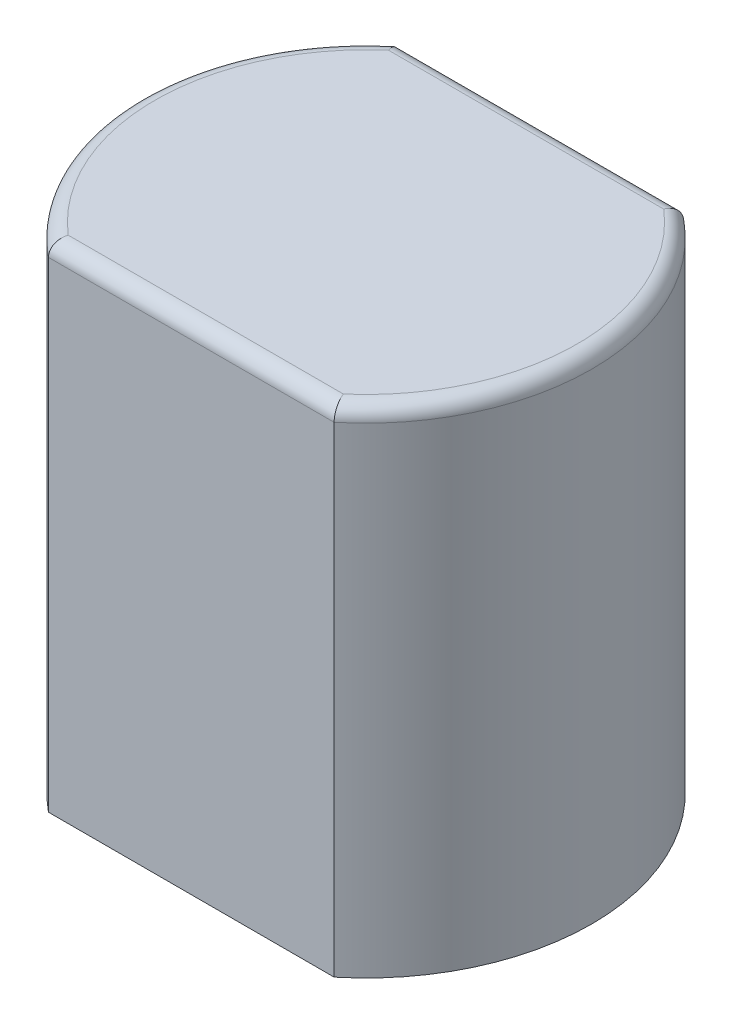
ISO-10303-21;
HEADER;
FILE_DESCRIPTION(('STEP AP214'),'2;1');
FILE_NAME('part.step','',(''),(''),'','','');
FILE_SCHEMA(('AUTOMOTIVE_DESIGN { 1 0 10303 214 1 1 1 1 }'));
ENDSEC;
DATA;
#1=APPLICATION_CONTEXT('core data for automotive mechanical design processes');
#2=APPLICATION_PROTOCOL_DEFINITION('international standard','automotive_design',2000,#1);
#3=PRODUCT_CONTEXT('',#1,'mechanical');
#4=PRODUCT('Part','Part','',(#3));
#5=PRODUCT_RELATED_PRODUCT_CATEGORY('part','',(#4));
#6=PRODUCT_DEFINITION_FORMATION('','',#4);
#7=PRODUCT_DEFINITION_CONTEXT('part definition',#1,'design');
#8=PRODUCT_DEFINITION('design','',#6,#7);
#9=PRODUCT_DEFINITION_SHAPE('','',#8);
#10=(LENGTH_UNIT() NAMED_UNIT(*) SI_UNIT(.MILLI.,.METRE.));
#11=(NAMED_UNIT(*) PLANE_ANGLE_UNIT() SI_UNIT($,.RADIAN.));
#12=(NAMED_UNIT(*) SI_UNIT($,.STERADIAN.) SOLID_ANGLE_UNIT());
#13=UNCERTAINTY_MEASURE_WITH_UNIT(LENGTH_MEASURE(1.E-05),#10,'distance_accuracy_value','');
#14=(GEOMETRIC_REPRESENTATION_CONTEXT(3) GLOBAL_UNCERTAINTY_ASSIGNED_CONTEXT((#13)) GLOBAL_UNIT_ASSIGNED_CONTEXT((#10,
#11,#12)) REPRESENTATION_CONTEXT('',''));
#15=CARTESIAN_POINT('',(0.,0.,0.));
#16=DIRECTION('',(0.,0.,1.));
#17=DIRECTION('',(1.,0.,0.));
#18=AXIS2_PLACEMENT_3D('',#15,#16,#17);
#19=CARTESIAN_POINT('',(0.,17.,0.));
#20=DIRECTION('',(0.,-1.,0.));
#21=DIRECTION('',(0.,0.,-1.));
#22=AXIS2_PLACEMENT_3D('',#19,#20,#21);
#23=CYLINDRICAL_SURFACE('',#22,7.75);
#24=DIRECTION('',(0.,-1.,0.));
#25=VECTOR('',#24,1.);
#26=CARTESIAN_POINT('',(4.90535421758714,17.,-6.));
#27=LINE('',#26,#25);
#28=CARTESIAN_POINT('',(4.90535421758714,16.5,-6.));
#29=VERTEX_POINT('',#28);
#30=CARTESIAN_POINT('',(4.90535421758714,0.,-6.));
#31=VERTEX_POINT('',#30);
#32=EDGE_CURVE('E88',#29,#31,#27,.T.);
#33=ORIENTED_EDGE('',*,*,#32,.F.);
#34=CARTESIAN_POINT('',(0.,16.5,0.));
#35=DIRECTION('',(0.,1.,0.));
#36=DIRECTION('',(0.,0.,1.));
#37=AXIS2_PLACEMENT_3D('',#34,#35,#36);
#38=CIRCLE('',#37,7.75);
#39=CARTESIAN_POINT('',(4.90535421758714,16.5,6.));
#40=VERTEX_POINT('',#39);
#41=EDGE_CURVE('E45',#29,#40,#38,.F.);
#42=ORIENTED_EDGE('',*,*,#41,.T.);
#43=DIRECTION('',(0.,-1.,0.));
#44=VECTOR('',#43,1.);
#45=CARTESIAN_POINT('',(4.90535421758714,17.,6.));
#46=LINE('',#45,#44);
#47=CARTESIAN_POINT('',(4.90535421758714,0.,6.));
#48=VERTEX_POINT('',#47);
#49=EDGE_CURVE('E105',#40,#48,#46,.T.);
#50=ORIENTED_EDGE('',*,*,#49,.T.);
#51=CARTESIAN_POINT('',(0.,0.,0.));
#52=DIRECTION('',(0.,1.,0.));
#53=DIRECTION('',(0.,0.,1.));
#54=AXIS2_PLACEMENT_3D('',#51,#52,#53);
#55=CIRCLE('',#54,7.75);
#56=EDGE_CURVE('E101',#48,#31,#55,.T.);
#57=ORIENTED_EDGE('',*,*,#56,.T.);
#58=EDGE_LOOP('',(#33,#42,#50,#57));
#59=FACE_BOUND('',#58,.T.);
#60=ADVANCED_FACE('F32',(#59),#23,.T.);
#61=CARTESIAN_POINT('',(-4.90535421758715,17.,-6.));
#62=DIRECTION('',(0.,0.,1.));
#63=DIRECTION('',(1.,0.,0.));
#64=AXIS2_PLACEMENT_3D('',#61,#62,#63);
#65=PLANE('',#64);
#66=DIRECTION('',(0.,-1.,0.));
#67=VECTOR('',#66,1.);
#68=CARTESIAN_POINT('',(-4.90535421758715,17.,-6.));
#69=LINE('',#68,#67);
#70=CARTESIAN_POINT('',(-4.90535421758715,16.5,-6.));
#71=VERTEX_POINT('',#70);
#72=CARTESIAN_POINT('',(-4.90535421758715,0.,-6.));
#73=VERTEX_POINT('',#72);
#74=EDGE_CURVE('E95',#71,#73,#69,.T.);
#75=ORIENTED_EDGE('',*,*,#74,.F.);
#76=DIRECTION('',(-1.,0.,0.));
#77=VECTOR('',#76,1.);
#78=CARTESIAN_POINT('',(4.90535421758714,16.5,-6.));
#79=LINE('',#78,#77);
#80=EDGE_CURVE('E60',#71,#29,#79,.F.);
#81=ORIENTED_EDGE('',*,*,#80,.T.);
#82=ORIENTED_EDGE('',*,*,#32,.T.);
#83=DIRECTION('',(-1.,0.,0.));
#84=VECTOR('',#83,1.);
#85=CARTESIAN_POINT('',(-4.90535421758715,0.,-6.));
#86=LINE('',#85,#84);
#87=EDGE_CURVE('E91',#31,#73,#86,.T.);
#88=ORIENTED_EDGE('',*,*,#87,.T.);
#89=EDGE_LOOP('',(#75,#81,#82,#88));
#90=FACE_BOUND('',#89,.T.);
#91=ADVANCED_FACE('F90',(#90),#65,.F.);
#92=CARTESIAN_POINT('',(0.,17.,0.));
#93=DIRECTION('',(0.,-1.,0.));
#94=DIRECTION('',(0.,0.,-1.));
#95=AXIS2_PLACEMENT_3D('',#92,#93,#94);
#96=CYLINDRICAL_SURFACE('',#95,7.75);
#97=DIRECTION('',(0.,-1.,0.));
#98=VECTOR('',#97,1.);
#99=CARTESIAN_POINT('',(-4.90535421758715,17.,6.));
#100=LINE('',#99,#98);
#101=CARTESIAN_POINT('',(-4.90535421758715,16.5,6.));
#102=VERTEX_POINT('',#101);
#103=CARTESIAN_POINT('',(-4.90535421758715,0.,6.));
#104=VERTEX_POINT('',#103);
#105=EDGE_CURVE('E115',#102,#104,#100,.T.);
#106=ORIENTED_EDGE('',*,*,#105,.F.);
#107=CARTESIAN_POINT('',(0.,16.5,0.));
#108=DIRECTION('',(0.,1.,0.));
#109=DIRECTION('',(0.,0.,1.));
#110=AXIS2_PLACEMENT_3D('',#107,#108,#109);
#111=CIRCLE('',#110,7.75);
#112=EDGE_CURVE('E126',#102,#71,#111,.F.);
#113=ORIENTED_EDGE('',*,*,#112,.T.);
#114=ORIENTED_EDGE('',*,*,#74,.T.);
#115=CARTESIAN_POINT('',(0.,0.,0.));
#116=DIRECTION('',(0.,1.,0.));
#117=DIRECTION('',(0.,0.,1.));
#118=AXIS2_PLACEMENT_3D('',#115,#116,#117);
#119=CIRCLE('',#118,7.75);
#120=EDGE_CURVE('E103',#73,#104,#119,.T.);
#121=ORIENTED_EDGE('',*,*,#120,.T.);
#122=EDGE_LOOP('',(#106,#113,#114,#121));
#123=FACE_BOUND('',#122,.T.);
#124=ADVANCED_FACE('F169',(#123),#96,.T.);
#125=CARTESIAN_POINT('',(-4.90535421758715,17.,6.));
#126=DIRECTION('',(0.,0.,-1.));
#127=DIRECTION('',(-1.,0.,0.));
#128=AXIS2_PLACEMENT_3D('',#125,#126,#127);
#129=PLANE('',#128);
#130=ORIENTED_EDGE('',*,*,#49,.F.);
#131=DIRECTION('',(1.,0.,0.));
#132=VECTOR('',#131,1.);
#133=CARTESIAN_POINT('',(-4.90535421758715,16.5,6.));
#134=LINE('',#133,#132);
#135=EDGE_CURVE('E11',#40,#102,#134,.F.);
#136=ORIENTED_EDGE('',*,*,#135,.T.);
#137=ORIENTED_EDGE('',*,*,#105,.T.);
#138=DIRECTION('',(1.,0.,0.));
#139=VECTOR('',#138,1.);
#140=CARTESIAN_POINT('',(-4.90535421758715,0.,6.));
#141=LINE('',#140,#139);
#142=EDGE_CURVE('E112',#104,#48,#141,.T.);
#143=ORIENTED_EDGE('',*,*,#142,.T.);
#144=EDGE_LOOP('',(#130,#136,#137,#143));
#145=FACE_BOUND('',#144,.T.);
#146=ADVANCED_FACE('F171',(#145),#129,.F.);
#147=CARTESIAN_POINT('',(0.,17.,0.));
#148=DIRECTION('',(0.,1.,0.));
#149=DIRECTION('',(0.,0.,1.));
#150=AXIS2_PLACEMENT_3D('',#147,#148,#149);
#151=PLANE('',#150);
#152=DIRECTION('',(-1.,0.,0.));
#153=VECTOR('',#152,1.);
#154=CARTESIAN_POINT('',(-4.90535421758715,17.,-5.5));
#155=LINE('',#154,#153);
#156=CARTESIAN_POINT('',(4.72361090692281,17.,-5.49999999999998));
#157=VERTEX_POINT('',#156);
#158=CARTESIAN_POINT('',(-4.72361090692281,17.,-5.5));
#159=VERTEX_POINT('',#158);
#160=EDGE_CURVE('E121',#157,#159,#155,.T.);
#161=ORIENTED_EDGE('',*,*,#160,.T.);
#162=CARTESIAN_POINT('',(0.,17.,0.));
#163=DIRECTION('',(0.,1.,0.));
#164=DIRECTION('',(0.,0.,1.));
#165=AXIS2_PLACEMENT_3D('',#162,#163,#164);
#166=CIRCLE('',#165,7.25);
#167=CARTESIAN_POINT('',(-4.72361090692281,17.,5.5));
#168=VERTEX_POINT('',#167);
#169=EDGE_CURVE('E123',#159,#168,#166,.T.);
#170=ORIENTED_EDGE('',*,*,#169,.T.);
#171=DIRECTION('',(1.,0.,0.));
#172=VECTOR('',#171,1.);
#173=CARTESIAN_POINT('',(4.90535421758714,17.,5.5));
#174=LINE('',#173,#172);
#175=CARTESIAN_POINT('',(4.72361090692281,17.,5.5));
#176=VERTEX_POINT('',#175);
#177=EDGE_CURVE('E94',#168,#176,#174,.T.);
#178=ORIENTED_EDGE('',*,*,#177,.T.);
#179=CARTESIAN_POINT('',(0.,17.,0.));
#180=DIRECTION('',(0.,1.,0.));
#181=DIRECTION('',(0.,0.,1.));
#182=AXIS2_PLACEMENT_3D('',#179,#180,#181);
#183=CIRCLE('',#182,7.25);
#184=EDGE_CURVE('E119',#176,#157,#183,.T.);
#185=ORIENTED_EDGE('',*,*,#184,.T.);
#186=EDGE_LOOP('',(#161,#170,#178,#185));
#187=FACE_BOUND('',#186,.T.);
#188=ADVANCED_FACE('F174',(#187),#151,.T.);
#189=CARTESIAN_POINT('',(0.,0.,0.));
#190=DIRECTION('',(0.,1.,0.));
#191=DIRECTION('',(0.,0.,1.));
#192=AXIS2_PLACEMENT_3D('',#189,#190,#191);
#193=PLANE('',#192);
#194=ORIENTED_EDGE('',*,*,#56,.F.);
#195=ORIENTED_EDGE('',*,*,#142,.F.);
#196=ORIENTED_EDGE('',*,*,#120,.F.);
#197=ORIENTED_EDGE('',*,*,#87,.F.);
#198=EDGE_LOOP('',(#194,#195,#196,#197));
#199=FACE_BOUND('',#198,.T.);
#200=ADVANCED_FACE('F99',(#199),#193,.F.);
#201=CARTESIAN_POINT('',(0.,16.5,0.));
#202=DIRECTION('',(0.,1.,0.));
#203=DIRECTION('',(0.,0.,1.));
#204=AXIS2_PLACEMENT_3D('',#201,#202,#203);
#205=TOROIDAL_SURFACE('',#204,7.25,0.5);
#206=CARTESIAN_POINT('',(4.90535421758714,16.5,6.));
#207=CARTESIAN_POINT('',(4.9053637449977,16.5269396909008,6.0000287275371));
#208=CARTESIAN_POINT('',(4.90457816797194,16.5538630043126,5.99782470688364));
#209=CARTESIAN_POINT('',(4.90149074051213,16.6068684015842,5.98917349745749));
#210=CARTESIAN_POINT('',(4.8991923838763,16.6329522788926,5.98273608582564));
#211=CARTESIAN_POINT('',(4.89315295754012,16.6835992170977,5.96583924066967));
#212=CARTESIAN_POINT('',(4.88941200053084,16.7081623966124,5.95538012130797));
#213=CARTESIAN_POINT('',(4.88061406542073,16.755137936223,5.93082121108423));
#214=CARTESIAN_POINT('',(4.87555679366707,16.7775498148625,5.91672060785962));
#215=CARTESIAN_POINT('',(4.86414649466028,16.8201924397035,5.88496798256607));
#216=CARTESIAN_POINT('',(4.85776550787314,16.8403586255413,5.86723946429443));
#217=CARTESIAN_POINT('',(4.84397223332571,16.8774455682612,5.8290055641365));
#218=CARTESIAN_POINT('',(4.83655960135012,16.8943652374207,5.80849925548315));
#219=CARTESIAN_POINT('',(4.82046808202842,16.9254725948944,5.7640983873088));
#220=CARTESIAN_POINT('',(4.81174186339288,16.9394577114143,5.74007922822739));
#221=CARTESIAN_POINT('',(4.79359514273842,16.9632010570824,5.69027777197868));
#222=CARTESIAN_POINT('',(4.78417457378973,16.972958878128,5.66449530485997));
#223=CARTESIAN_POINT('',(4.76657823763739,16.9867659313864,5.61648704956854));
#224=CARTESIAN_POINT('',(4.75847452405752,16.991516876218,5.59443213098639));
#225=CARTESIAN_POINT('',(4.74209735452167,16.9980011482562,5.54997730033247));
#226=CARTESIAN_POINT('',(4.73382424836705,16.9997401624029,5.52757811916841));
#227=CARTESIAN_POINT('',(4.72489394912523,16.9999910233577,5.50346354591126));
#228=CARTESIAN_POINT('',(4.7242524575995,17.0000000223416,5.50173167481895));
#229=CARTESIAN_POINT('',(4.7236109069228,17.,5.5));
#230=B_SPLINE_CURVE_WITH_KNOTS('',3,(#206,#207,#208,#209,#210,#211,#212,#213,#214,#215,#216,
#217,#218,#219,#220,#221,#222,#223,#224,#225,#226,#227,#228,#229),.UNSPECIFIED.,.F.,.F.,(4,2,2,
2,2,2,2,2,2,2,2,4),(0.,0.0806924452869708,0.16119918042234,0.241699627916836,0.322218049437955,
0.404651679503081,0.487112880333414,0.574129731072823,0.661154980534719,0.732892096915645,
0.804493615469089,0.81003415551596),.UNSPECIFIED.);
#231=EDGE_CURVE('E109',#40,#176,#230,.T.);
#232=ORIENTED_EDGE('',*,*,#231,.F.);
#233=ORIENTED_EDGE('',*,*,#41,.F.);
#234=CARTESIAN_POINT('',(4.90535421758714,16.5,-6.));
#235=CARTESIAN_POINT('',(4.9053637449977,16.5269396909008,-6.0000287275371));
#236=CARTESIAN_POINT('',(4.90457816797194,16.5538630043126,-5.99782470688364));
#237=CARTESIAN_POINT('',(4.90149074051213,16.6068684015842,-5.98917349745749));
#238=CARTESIAN_POINT('',(4.8991923838763,16.6329522788926,-5.98273608582564));
#239=CARTESIAN_POINT('',(4.89315295754012,16.6835992170977,-5.96583924066967));
#240=CARTESIAN_POINT('',(4.88941200053084,16.7081623966124,-5.95538012130797));
#241=CARTESIAN_POINT('',(4.88061406542073,16.755137936223,-5.93082121108423));
#242=CARTESIAN_POINT('',(4.87555679366707,16.7775498148625,-5.91672060785962));
#243=CARTESIAN_POINT('',(4.86414649466028,16.8201924397035,-5.88496798256607));
#244=CARTESIAN_POINT('',(4.85776550787314,16.8403586255413,-5.86723946429443));
#245=CARTESIAN_POINT('',(4.84397223332571,16.8774455682612,-5.8290055641365));
#246=CARTESIAN_POINT('',(4.83655960135012,16.8943652374207,-5.80849925548315));
#247=CARTESIAN_POINT('',(4.82046808202842,16.9254725948944,-5.7640983873088));
#248=CARTESIAN_POINT('',(4.81174186339288,16.9394577114143,-5.74007922822739));
#249=CARTESIAN_POINT('',(4.79359514273842,16.9632010570824,-5.69027777197868));
#250=CARTESIAN_POINT('',(4.78417457378973,16.972958878128,-5.66449530485997));
#251=CARTESIAN_POINT('',(4.76657823763739,16.9867659313864,-5.61648704956854));
#252=CARTESIAN_POINT('',(4.75847452405752,16.991516876218,-5.59443213098639));
#253=CARTESIAN_POINT('',(4.74209735452167,16.9980011482562,-5.54997730033247));
#254=CARTESIAN_POINT('',(4.73382424836705,16.9997401624029,-5.52757811916841));
#255=CARTESIAN_POINT('',(4.72489394912523,16.9999910233577,-5.50346354591126));
#256=CARTESIAN_POINT('',(4.7242524575995,17.0000000223416,-5.50173167481895));
#257=CARTESIAN_POINT('',(4.7236109069228,17.,-5.5));
#258=B_SPLINE_CURVE_WITH_KNOTS('',3,(#234,#235,#236,#237,#238,#239,#240,#241,#242,#243,#244,
#245,#246,#247,#248,#249,#250,#251,#252,#253,#254,#255,#256,#257),.UNSPECIFIED.,.F.,.F.,(4,2,2,
2,2,2,2,2,2,2,2,4),(0.,0.0806924452869708,0.16119918042234,0.241699627916836,0.322218049437955,
0.404651679503081,0.487112880333414,0.574129731072823,0.661154980534719,0.732892096915645,
0.804493615469089,0.81003415551596),.UNSPECIFIED.);
#259=EDGE_CURVE('E37',#157,#29,#258,.F.);
#260=ORIENTED_EDGE('',*,*,#259,.F.);
#261=ORIENTED_EDGE('',*,*,#184,.F.);
#262=EDGE_LOOP('',(#232,#233,#260,#261));
#263=FACE_BOUND('',#262,.T.);
#264=ADVANCED_FACE('F34',(#263),#205,.T.);
#265=CARTESIAN_POINT('',(0.,16.5,-5.5));
#266=DIRECTION('',(1.,0.,0.));
#267=DIRECTION('',(0.,0.,-1.));
#268=AXIS2_PLACEMENT_3D('',#265,#266,#267);
#269=CYLINDRICAL_SURFACE('',#268,0.5);
#270=ORIENTED_EDGE('',*,*,#259,.T.);
#271=ORIENTED_EDGE('',*,*,#80,.F.);
#272=CARTESIAN_POINT('',(-4.90535421758715,16.5,-6.));
#273=CARTESIAN_POINT('',(-4.9053637449977,16.5269396909008,-6.0000287275371));
#274=CARTESIAN_POINT('',(-4.90457816797194,16.5538630043126,-5.99782470688364));
#275=CARTESIAN_POINT('',(-4.90149074051213,16.6068684015842,-5.98917349745749));
#276=CARTESIAN_POINT('',(-4.89919238387631,16.6329522788926,-5.98273608582564));
#277=CARTESIAN_POINT('',(-4.89315295754013,16.6835992170977,-5.96583924066967));
#278=CARTESIAN_POINT('',(-4.88941200053084,16.7081623966124,-5.95538012130797));
#279=CARTESIAN_POINT('',(-4.88061406542074,16.755137936223,-5.93082121108423));
#280=CARTESIAN_POINT('',(-4.87555679366708,16.7775498148625,-5.91672060785962));
#281=CARTESIAN_POINT('',(-4.86414649466028,16.8201924397035,-5.88496798256607));
#282=CARTESIAN_POINT('',(-4.85776550787314,16.8403586255413,-5.86723946429443));
#283=CARTESIAN_POINT('',(-4.84397223332571,16.8774455682612,-5.82900556413651));
#284=CARTESIAN_POINT('',(-4.83655960135012,16.8943652374207,-5.80849925548315));
#285=CARTESIAN_POINT('',(-4.82046808202843,16.9254725948944,-5.7640983873088));
#286=CARTESIAN_POINT('',(-4.81174186339288,16.9394577114143,-5.74007922822739));
#287=CARTESIAN_POINT('',(-4.79359514273843,16.9632010570824,-5.69027777197868));
#288=CARTESIAN_POINT('',(-4.78417457378973,16.972958878128,-5.66449530485997));
#289=CARTESIAN_POINT('',(-4.76657823763739,16.9867659313864,-5.61648704956854));
#290=CARTESIAN_POINT('',(-4.75847452405752,16.991516876218,-5.59443213098639));
#291=CARTESIAN_POINT('',(-4.74209735452168,16.9980011482562,-5.54997730033246));
#292=CARTESIAN_POINT('',(-4.73382424836707,16.9997401624029,-5.5275781191684));
#293=CARTESIAN_POINT('',(-4.72489394912523,16.9999910233577,-5.50346354591126));
#294=CARTESIAN_POINT('',(-4.7242524575995,17.0000000223416,-5.50173167481895));
#295=CARTESIAN_POINT('',(-4.7236109069228,17.,-5.5));
#296=B_SPLINE_CURVE_WITH_KNOTS('',3,(#272,#273,#274,#275,#276,#277,#278,#279,#280,#281,#282,
#283,#284,#285,#286,#287,#288,#289,#290,#291,#292,#293,#294,#295),.UNSPECIFIED.,.F.,.F.,(4,2,2,
2,2,2,2,2,2,2,2,4),(0.,0.0806924452869708,0.16119918042234,0.241699627916836,0.322218049437955,
0.404651679503081,0.487112880333413,0.574129731072823,0.661154980534721,0.732892096915647,
0.804493615469089,0.81003415551596),.UNSPECIFIED.);
#297=EDGE_CURVE('E138',#159,#71,#296,.F.);
#298=ORIENTED_EDGE('',*,*,#297,.F.);
#299=ORIENTED_EDGE('',*,*,#160,.F.);
#300=EDGE_LOOP('',(#270,#271,#298,#299));
#301=FACE_BOUND('',#300,.T.);
#302=ADVANCED_FACE('F148',(#301),#269,.T.);
#303=CARTESIAN_POINT('',(0.,16.5,5.5));
#304=DIRECTION('',(-1.,0.,0.));
#305=DIRECTION('',(0.,0.,1.));
#306=AXIS2_PLACEMENT_3D('',#303,#304,#305);
#307=CYLINDRICAL_SURFACE('',#306,0.5);
#308=ORIENTED_EDGE('',*,*,#231,.T.);
#309=ORIENTED_EDGE('',*,*,#177,.F.);
#310=CARTESIAN_POINT('',(-4.90535421758715,16.5,6.));
#311=CARTESIAN_POINT('',(-4.9053637449977,16.5269396909008,6.0000287275371));
#312=CARTESIAN_POINT('',(-4.90457816797194,16.5538630043126,5.99782470688364));
#313=CARTESIAN_POINT('',(-4.90149074051213,16.6068684015842,5.98917349745749));
#314=CARTESIAN_POINT('',(-4.89919238387631,16.6329522788926,5.98273608582564));
#315=CARTESIAN_POINT('',(-4.89315295754013,16.6835992170977,5.96583924066967));
#316=CARTESIAN_POINT('',(-4.88941200053084,16.7081623966124,5.95538012130797));
#317=CARTESIAN_POINT('',(-4.88061406542074,16.755137936223,5.93082121108423));
#318=CARTESIAN_POINT('',(-4.87555679366708,16.7775498148625,5.91672060785962));
#319=CARTESIAN_POINT('',(-4.86414649466028,16.8201924397035,5.88496798256607));
#320=CARTESIAN_POINT('',(-4.85776550787315,16.8403586255413,5.86723946429443));
#321=CARTESIAN_POINT('',(-4.84397223332571,16.8774455682612,5.8290055641365));
#322=CARTESIAN_POINT('',(-4.83655960135012,16.8943652374207,5.80849925548315));
#323=CARTESIAN_POINT('',(-4.82046808202842,16.9254725948944,5.7640983873088));
#324=CARTESIAN_POINT('',(-4.81174186339288,16.9394577114143,5.74007922822739));
#325=CARTESIAN_POINT('',(-4.79359514273843,16.9632010570824,5.69027777197868));
#326=CARTESIAN_POINT('',(-4.78417457378974,16.972958878128,5.66449530485996));
#327=CARTESIAN_POINT('',(-4.76657823763739,16.9867659313864,5.61648704956854));
#328=CARTESIAN_POINT('',(-4.75847452405751,16.991516876218,5.5944321309864));
#329=CARTESIAN_POINT('',(-4.74209735452168,16.9980011482562,5.54997730033246));
#330=CARTESIAN_POINT('',(-4.7338242483671,16.9997401624029,5.52757811916839));
#331=CARTESIAN_POINT('',(-4.72489394912524,16.9999910233577,5.50346354591126));
#332=CARTESIAN_POINT('',(-4.72425245759951,17.0000000223416,5.50173167481895));
#333=CARTESIAN_POINT('',(-4.7236109069228,17.,5.5));
#334=B_SPLINE_CURVE_WITH_KNOTS('',3,(#310,#311,#312,#313,#314,#315,#316,#317,#318,#319,#320,
#321,#322,#323,#324,#325,#326,#327,#328,#329,#330,#331,#332,#333),.UNSPECIFIED.,.F.,.F.,(4,2,2,
2,2,2,2,2,2,2,2,4),(0.,0.0806924452869708,0.16119918042234,0.241699627916836,0.322218049437955,
0.404651679503081,0.487112880333413,0.574129731072823,0.661154980534721,0.732892096915644,
0.80449361546909,0.810034155515961),.UNSPECIFIED.);
#335=EDGE_CURVE('E131',#102,#168,#334,.T.);
#336=ORIENTED_EDGE('',*,*,#335,.F.);
#337=ORIENTED_EDGE('',*,*,#135,.F.);
#338=EDGE_LOOP('',(#308,#309,#336,#337));
#339=FACE_BOUND('',#338,.T.);
#340=ADVANCED_FACE('F145',(#339),#307,.T.);
#341=CARTESIAN_POINT('',(0.,16.5,0.));
#342=DIRECTION('',(0.,1.,0.));
#343=DIRECTION('',(0.,0.,1.));
#344=AXIS2_PLACEMENT_3D('',#341,#342,#343);
#345=TOROIDAL_SURFACE('',#344,7.25,0.5);
#346=ORIENTED_EDGE('',*,*,#297,.T.);
#347=ORIENTED_EDGE('',*,*,#112,.F.);
#348=ORIENTED_EDGE('',*,*,#335,.T.);
#349=ORIENTED_EDGE('',*,*,#169,.F.);
#350=EDGE_LOOP('',(#346,#347,#348,#349));
#351=FACE_BOUND('',#350,.T.);
#352=ADVANCED_FACE('F142',(#351),#345,.T.);
#353=CLOSED_SHELL('',(#60,#91,#124,#146,#188,#200,#264,#302,#340,#352));
#354=MANIFOLD_SOLID_BREP('B2',#353);
#355=ADVANCED_BREP_SHAPE_REPRESENTATION('',(#18,#354),#14);
#356=SHAPE_DEFINITION_REPRESENTATION(#9,#355);
ENDSEC;
END-ISO-10303-21;
